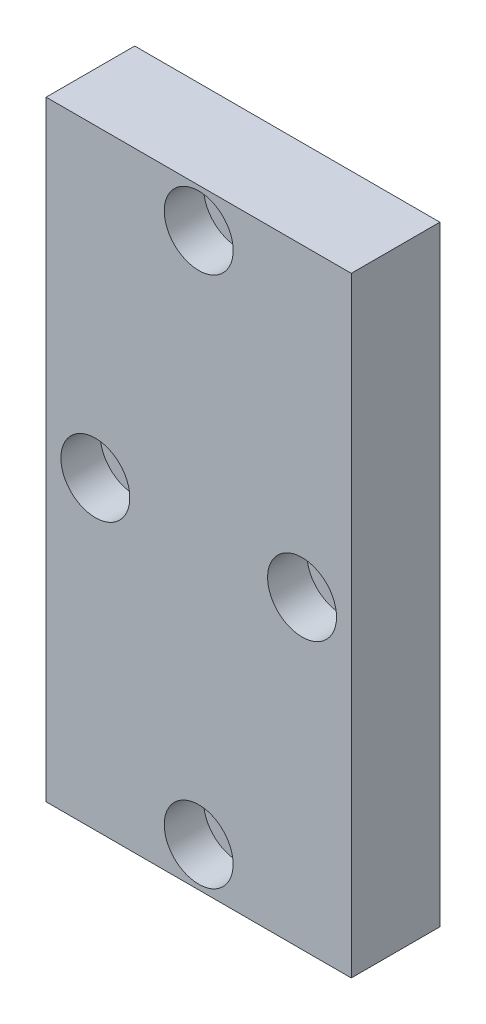
ISO-10303-21;
HEADER;
FILE_DESCRIPTION(('STEP AP214'),'2;1');
FILE_NAME('part.step','',(''),(''),'','','');
FILE_SCHEMA(('AUTOMOTIVE_DESIGN { 1 0 10303 214 1 1 1 1 }'));
ENDSEC;
DATA;
#1=APPLICATION_CONTEXT('core data for automotive mechanical design processes');
#2=APPLICATION_PROTOCOL_DEFINITION('international standard','automotive_design',2000,#1);
#3=PRODUCT_CONTEXT('',#1,'mechanical');
#4=PRODUCT('Part','Part','',(#3));
#5=PRODUCT_RELATED_PRODUCT_CATEGORY('part','',(#4));
#6=PRODUCT_DEFINITION_FORMATION('','',#4);
#7=PRODUCT_DEFINITION_CONTEXT('part definition',#1,'design');
#8=PRODUCT_DEFINITION('design','',#6,#7);
#9=PRODUCT_DEFINITION_SHAPE('','',#8);
#10=(LENGTH_UNIT() NAMED_UNIT(*) SI_UNIT(.MILLI.,.METRE.));
#11=(NAMED_UNIT(*) PLANE_ANGLE_UNIT() SI_UNIT($,.RADIAN.));
#12=(NAMED_UNIT(*) SI_UNIT($,.STERADIAN.) SOLID_ANGLE_UNIT());
#13=UNCERTAINTY_MEASURE_WITH_UNIT(LENGTH_MEASURE(1.E-05),#10,'distance_accuracy_value','');
#14=(GEOMETRIC_REPRESENTATION_CONTEXT(3) GLOBAL_UNCERTAINTY_ASSIGNED_CONTEXT((#13)) GLOBAL_UNIT_ASSIGNED_CONTEXT((#10,
#11,#12)) REPRESENTATION_CONTEXT('',''));
#15=CARTESIAN_POINT('',(0.,0.,0.));
#16=DIRECTION('',(0.,0.,1.));
#17=DIRECTION('',(1.,0.,0.));
#18=AXIS2_PLACEMENT_3D('',#15,#16,#17);
#19=CARTESIAN_POINT('',(10.5,0.,-1.));
#20=DIRECTION('',(0.,0.,1.));
#21=DIRECTION('',(1.,0.,0.));
#22=AXIS2_PLACEMENT_3D('',#19,#20,#21);
#23=CYLINDRICAL_SURFACE('',#22,2.);
#24=CARTESIAN_POINT('',(10.5,0.,0.));
#25=DIRECTION('',(0.,0.,1.));
#26=DIRECTION('',(1.,0.,0.));
#27=AXIS2_PLACEMENT_3D('',#24,#25,#26);
#28=CIRCLE('',#27,2.);
#29=CARTESIAN_POINT('',(12.5,0.,0.));
#30=VERTEX_POINT('',#29);
#31=EDGE_CURVE('E125',#30,#30,#28,.T.);
#32=ORIENTED_EDGE('',*,*,#31,.F.);
#33=EDGE_LOOP('',(#32));
#34=FACE_BOUND('',#33,.T.);
#35=CARTESIAN_POINT('',(10.5,0.,5.));
#36=DIRECTION('',(0.,0.,1.));
#37=DIRECTION('',(1.,0.,0.));
#38=AXIS2_PLACEMENT_3D('',#35,#36,#37);
#39=CIRCLE('',#38,2.);
#40=CARTESIAN_POINT('',(12.5,0.,5.));
#41=VERTEX_POINT('',#40);
#42=EDGE_CURVE('E42',#41,#41,#39,.F.);
#43=ORIENTED_EDGE('',*,*,#42,.F.);
#44=EDGE_LOOP('',(#43));
#45=FACE_BOUND('',#44,.T.);
#46=ADVANCED_FACE('F38',(#34,#45),#23,.F.);
#47=CARTESIAN_POINT('',(0.,27.,-1.));
#48=DIRECTION('',(0.,0.,1.));
#49=DIRECTION('',(1.,0.,0.));
#50=AXIS2_PLACEMENT_3D('',#47,#48,#49);
#51=CYLINDRICAL_SURFACE('',#50,2.);
#52=CARTESIAN_POINT('',(0.,27.,0.));
#53=DIRECTION('',(0.,0.,1.));
#54=DIRECTION('',(1.,0.,0.));
#55=AXIS2_PLACEMENT_3D('',#52,#53,#54);
#56=CIRCLE('',#55,2.);
#57=CARTESIAN_POINT('',(2.,27.,0.));
#58=VERTEX_POINT('',#57);
#59=EDGE_CURVE('E114',#58,#58,#56,.T.);
#60=ORIENTED_EDGE('',*,*,#59,.F.);
#61=EDGE_LOOP('',(#60));
#62=FACE_BOUND('',#61,.T.);
#63=CARTESIAN_POINT('',(0.,27.,5.));
#64=DIRECTION('',(0.,0.,1.));
#65=DIRECTION('',(1.,0.,0.));
#66=AXIS2_PLACEMENT_3D('',#63,#64,#65);
#67=CIRCLE('',#66,2.);
#68=CARTESIAN_POINT('',(2.,27.,5.));
#69=VERTEX_POINT('',#68);
#70=EDGE_CURVE('E140',#69,#69,#67,.F.);
#71=ORIENTED_EDGE('',*,*,#70,.F.);
#72=EDGE_LOOP('',(#71));
#73=FACE_BOUND('',#72,.T.);
#74=ADVANCED_FACE('F160',(#62,#73),#51,.F.);
#75=CARTESIAN_POINT('',(0.,0.,9.));
#76=DIRECTION('',(0.,0.,1.));
#77=DIRECTION('',(1.,0.,0.));
#78=AXIS2_PLACEMENT_3D('',#75,#76,#77);
#79=PLANE('',#78);
#80=CARTESIAN_POINT('',(0.,27.,9.));
#81=DIRECTION('',(0.,0.,1.));
#82=DIRECTION('',(1.,0.,0.));
#83=AXIS2_PLACEMENT_3D('',#80,#81,#82);
#84=CIRCLE('',#83,3.5);
#85=CARTESIAN_POINT('',(3.5,27.,9.));
#86=VERTEX_POINT('',#85);
#87=EDGE_CURVE('E245',#86,#86,#84,.T.);
#88=ORIENTED_EDGE('',*,*,#87,.F.);
#89=EDGE_LOOP('',(#88));
#90=FACE_BOUND('',#89,.T.);
#91=CARTESIAN_POINT('',(10.5,0.,9.));
#92=DIRECTION('',(0.,0.,1.));
#93=DIRECTION('',(1.,0.,0.));
#94=AXIS2_PLACEMENT_3D('',#91,#92,#93);
#95=CIRCLE('',#94,3.5);
#96=CARTESIAN_POINT('',(14.,0.,9.));
#97=VERTEX_POINT('',#96);
#98=EDGE_CURVE('E253',#97,#97,#95,.T.);
#99=ORIENTED_EDGE('',*,*,#98,.F.);
#100=EDGE_LOOP('',(#99));
#101=FACE_BOUND('',#100,.T.);
#102=CARTESIAN_POINT('',(-10.5,0.,9.));
#103=DIRECTION('',(0.,0.,1.));
#104=DIRECTION('',(-1.,0.,0.));
#105=AXIS2_PLACEMENT_3D('',#102,#103,#104);
#106=CIRCLE('',#105,3.5);
#107=CARTESIAN_POINT('',(-14.,0.,9.));
#108=VERTEX_POINT('',#107);
#109=EDGE_CURVE('E263',#108,#108,#106,.T.);
#110=ORIENTED_EDGE('',*,*,#109,.F.);
#111=EDGE_LOOP('',(#110));
#112=FACE_BOUND('',#111,.T.);
#113=CARTESIAN_POINT('',(0.,-27.,9.));
#114=DIRECTION('',(0.,0.,1.));
#115=DIRECTION('',(-1.,0.,0.));
#116=AXIS2_PLACEMENT_3D('',#113,#114,#115);
#117=CIRCLE('',#116,3.5);
#118=CARTESIAN_POINT('',(-3.5,-27.,9.));
#119=VERTEX_POINT('',#118);
#120=EDGE_CURVE('E271',#119,#119,#117,.T.);
#121=ORIENTED_EDGE('',*,*,#120,.F.);
#122=EDGE_LOOP('',(#121));
#123=FACE_BOUND('',#122,.T.);
#124=DIRECTION('',(0.,-1.,0.));
#125=VECTOR('',#124,1.);
#126=CARTESIAN_POINT('',(-15.5,31.,9.));
#127=LINE('',#126,#125);
#128=CARTESIAN_POINT('',(-15.5,31.,9.));
#129=VERTEX_POINT('',#128);
#130=CARTESIAN_POINT('',(-15.5,-31.,9.));
#131=VERTEX_POINT('',#130);
#132=EDGE_CURVE('E93',#129,#131,#127,.T.);
#133=ORIENTED_EDGE('',*,*,#132,.T.);
#134=DIRECTION('',(1.,0.,0.));
#135=VECTOR('',#134,1.);
#136=CARTESIAN_POINT('',(-15.5,-31.,9.));
#137=LINE('',#136,#135);
#138=CARTESIAN_POINT('',(15.5,-31.,9.));
#139=VERTEX_POINT('',#138);
#140=EDGE_CURVE('E88',#131,#139,#137,.T.);
#141=ORIENTED_EDGE('',*,*,#140,.T.);
#142=DIRECTION('',(0.,1.,0.));
#143=VECTOR('',#142,1.);
#144=CARTESIAN_POINT('',(15.5,31.,9.));
#145=LINE('',#144,#143);
#146=CARTESIAN_POINT('',(15.5,31.,9.));
#147=VERTEX_POINT('',#146);
#148=EDGE_CURVE('E91',#139,#147,#145,.T.);
#149=ORIENTED_EDGE('',*,*,#148,.T.);
#150=DIRECTION('',(-1.,0.,0.));
#151=VECTOR('',#150,1.);
#152=CARTESIAN_POINT('',(-15.5,31.,9.));
#153=LINE('',#152,#151);
#154=EDGE_CURVE('E58',#147,#129,#153,.T.);
#155=ORIENTED_EDGE('',*,*,#154,.T.);
#156=EDGE_LOOP('',(#133,#141,#149,#155));
#157=FACE_BOUND('',#156,.T.);
#158=ADVANCED_FACE('F89',(#90,#101,#112,#123,#157),#79,.T.);
#159=CARTESIAN_POINT('',(0.,0.,0.));
#160=DIRECTION('',(0.,0.,1.));
#161=DIRECTION('',(1.,0.,0.));
#162=AXIS2_PLACEMENT_3D('',#159,#160,#161);
#163=PLANE('',#162);
#164=ORIENTED_EDGE('',*,*,#59,.T.);
#165=EDGE_LOOP('',(#164));
#166=FACE_BOUND('',#165,.T.);
#167=ORIENTED_EDGE('',*,*,#31,.T.);
#168=EDGE_LOOP('',(#167));
#169=FACE_BOUND('',#168,.T.);
#170=DIRECTION('',(0.,-1.,0.));
#171=VECTOR('',#170,1.);
#172=CARTESIAN_POINT('',(-15.5,31.,0.));
#173=LINE('',#172,#171);
#174=CARTESIAN_POINT('',(-15.5,31.,0.));
#175=VERTEX_POINT('',#174);
#176=CARTESIAN_POINT('',(-15.5,-31.,0.));
#177=VERTEX_POINT('',#176);
#178=EDGE_CURVE('E110',#175,#177,#173,.T.);
#179=ORIENTED_EDGE('',*,*,#178,.F.);
#180=DIRECTION('',(-1.,0.,0.));
#181=VECTOR('',#180,1.);
#182=CARTESIAN_POINT('',(-15.5,31.,0.));
#183=LINE('',#182,#181);
#184=CARTESIAN_POINT('',(15.5,31.,0.));
#185=VERTEX_POINT('',#184);
#186=EDGE_CURVE('E81',#185,#175,#183,.T.);
#187=ORIENTED_EDGE('',*,*,#186,.F.);
#188=DIRECTION('',(0.,1.,0.));
#189=VECTOR('',#188,1.);
#190=CARTESIAN_POINT('',(15.5,31.,0.));
#191=LINE('',#190,#189);
#192=CARTESIAN_POINT('',(15.5,-31.,0.));
#193=VERTEX_POINT('',#192);
#194=EDGE_CURVE('E75',#193,#185,#191,.T.);
#195=ORIENTED_EDGE('',*,*,#194,.F.);
#196=DIRECTION('',(1.,0.,0.));
#197=VECTOR('',#196,1.);
#198=CARTESIAN_POINT('',(-15.5,-31.,0.));
#199=LINE('',#198,#197);
#200=EDGE_CURVE('E98',#177,#193,#199,.T.);
#201=ORIENTED_EDGE('',*,*,#200,.F.);
#202=EDGE_LOOP('',(#179,#187,#195,#201));
#203=FACE_BOUND('',#202,.T.);
#204=CARTESIAN_POINT('',(-10.5,0.,0.));
#205=DIRECTION('',(0.,0.,1.));
#206=DIRECTION('',(1.,0.,0.));
#207=AXIS2_PLACEMENT_3D('',#204,#205,#206);
#208=CIRCLE('',#207,2.);
#209=CARTESIAN_POINT('',(-8.49999999999999,0.,0.));
#210=VERTEX_POINT('',#209);
#211=EDGE_CURVE('E129',#210,#210,#208,.F.);
#212=ORIENTED_EDGE('',*,*,#211,.F.);
#213=EDGE_LOOP('',(#212));
#214=FACE_BOUND('',#213,.T.);
#215=CARTESIAN_POINT('',(0.,-27.,0.));
#216=DIRECTION('',(0.,0.,1.));
#217=DIRECTION('',(1.,0.,0.));
#218=AXIS2_PLACEMENT_3D('',#215,#216,#217);
#219=CIRCLE('',#218,2.);
#220=CARTESIAN_POINT('',(2.00000000000001,-27.,0.));
#221=VERTEX_POINT('',#220);
#222=EDGE_CURVE('E133',#221,#221,#219,.F.);
#223=ORIENTED_EDGE('',*,*,#222,.F.);
#224=EDGE_LOOP('',(#223));
#225=FACE_BOUND('',#224,.T.);
#226=ADVANCED_FACE('F176',(#166,#169,#203,#214,#225),#163,.F.);
#227=CARTESIAN_POINT('',(-15.5,31.,9.));
#228=DIRECTION('',(1.,0.,0.));
#229=DIRECTION('',(0.,1.,0.));
#230=AXIS2_PLACEMENT_3D('',#227,#228,#229);
#231=PLANE('',#230);
#232=ORIENTED_EDGE('',*,*,#178,.T.);
#233=DIRECTION('',(0.,0.,-1.));
#234=VECTOR('',#233,1.);
#235=CARTESIAN_POINT('',(-15.5,-31.,9.));
#236=LINE('',#235,#234);
#237=EDGE_CURVE('E11',#131,#177,#236,.T.);
#238=ORIENTED_EDGE('',*,*,#237,.F.);
#239=ORIENTED_EDGE('',*,*,#132,.F.);
#240=DIRECTION('',(0.,0.,-1.));
#241=VECTOR('',#240,1.);
#242=CARTESIAN_POINT('',(-15.5,31.,9.));
#243=LINE('',#242,#241);
#244=EDGE_CURVE('E106',#129,#175,#243,.T.);
#245=ORIENTED_EDGE('',*,*,#244,.T.);
#246=EDGE_LOOP('',(#232,#238,#239,#245));
#247=FACE_BOUND('',#246,.T.);
#248=ADVANCED_FACE('F40',(#247),#231,.F.);
#249=CARTESIAN_POINT('',(-15.5,-31.,9.));
#250=DIRECTION('',(0.,1.,0.));
#251=DIRECTION('',(0.,0.,1.));
#252=AXIS2_PLACEMENT_3D('',#249,#250,#251);
#253=PLANE('',#252);
#254=ORIENTED_EDGE('',*,*,#200,.T.);
#255=DIRECTION('',(0.,0.,-1.));
#256=VECTOR('',#255,1.);
#257=CARTESIAN_POINT('',(15.5,-31.,9.));
#258=LINE('',#257,#256);
#259=EDGE_CURVE('E49',#139,#193,#258,.T.);
#260=ORIENTED_EDGE('',*,*,#259,.F.);
#261=ORIENTED_EDGE('',*,*,#140,.F.);
#262=ORIENTED_EDGE('',*,*,#237,.T.);
#263=EDGE_LOOP('',(#254,#260,#261,#262));
#264=FACE_BOUND('',#263,.T.);
#265=ADVANCED_FACE('F97',(#264),#253,.F.);
#266=CARTESIAN_POINT('',(15.5,31.,9.));
#267=DIRECTION('',(-1.,0.,0.));
#268=DIRECTION('',(0.,-1.,0.));
#269=AXIS2_PLACEMENT_3D('',#266,#267,#268);
#270=PLANE('',#269);
#271=ORIENTED_EDGE('',*,*,#194,.T.);
#272=DIRECTION('',(0.,0.,-1.));
#273=VECTOR('',#272,1.);
#274=CARTESIAN_POINT('',(15.5,31.,9.));
#275=LINE('',#274,#273);
#276=EDGE_CURVE('E100',#147,#185,#275,.T.);
#277=ORIENTED_EDGE('',*,*,#276,.F.);
#278=ORIENTED_EDGE('',*,*,#148,.F.);
#279=ORIENTED_EDGE('',*,*,#259,.T.);
#280=EDGE_LOOP('',(#271,#277,#278,#279));
#281=FACE_BOUND('',#280,.T.);
#282=ADVANCED_FACE('F102',(#281),#270,.F.);
#283=CARTESIAN_POINT('',(-15.5,31.,9.));
#284=DIRECTION('',(0.,-1.,0.));
#285=DIRECTION('',(0.,0.,-1.));
#286=AXIS2_PLACEMENT_3D('',#283,#284,#285);
#287=PLANE('',#286);
#288=ORIENTED_EDGE('',*,*,#186,.T.);
#289=ORIENTED_EDGE('',*,*,#244,.F.);
#290=ORIENTED_EDGE('',*,*,#154,.F.);
#291=ORIENTED_EDGE('',*,*,#276,.T.);
#292=EDGE_LOOP('',(#288,#289,#290,#291));
#293=FACE_BOUND('',#292,.T.);
#294=ADVANCED_FACE('F181',(#293),#287,.F.);
#295=CARTESIAN_POINT('',(-10.5,0.,-1.));
#296=DIRECTION('',(0.,0.,1.));
#297=DIRECTION('',(1.,0.,0.));
#298=AXIS2_PLACEMENT_3D('',#295,#296,#297);
#299=CYLINDRICAL_SURFACE('',#298,2.);
#300=CARTESIAN_POINT('',(-10.5,0.,5.));
#301=DIRECTION('',(0.,0.,-1.));
#302=DIRECTION('',(-1.,0.,0.));
#303=AXIS2_PLACEMENT_3D('',#300,#301,#302);
#304=CIRCLE('',#303,2.);
#305=CARTESIAN_POINT('',(-12.5,0.,5.));
#306=VERTEX_POINT('',#305);
#307=EDGE_CURVE('E148',#306,#306,#304,.T.);
#308=ORIENTED_EDGE('',*,*,#307,.F.);
#309=EDGE_LOOP('',(#308));
#310=FACE_BOUND('',#309,.T.);
#311=ORIENTED_EDGE('',*,*,#211,.T.);
#312=EDGE_LOOP('',(#311));
#313=FACE_BOUND('',#312,.T.);
#314=ADVANCED_FACE('F172',(#310,#313),#299,.F.);
#315=CARTESIAN_POINT('',(0.,-27.,-1.));
#316=DIRECTION('',(0.,0.,1.));
#317=DIRECTION('',(1.,0.,0.));
#318=AXIS2_PLACEMENT_3D('',#315,#316,#317);
#319=CYLINDRICAL_SURFACE('',#318,2.);
#320=CARTESIAN_POINT('',(0.,-27.,5.));
#321=DIRECTION('',(0.,0.,-1.));
#322=DIRECTION('',(-1.,0.,0.));
#323=AXIS2_PLACEMENT_3D('',#320,#321,#322);
#324=CIRCLE('',#323,2.);
#325=CARTESIAN_POINT('',(-2.,-27.,5.));
#326=VERTEX_POINT('',#325);
#327=EDGE_CURVE('E144',#326,#326,#324,.T.);
#328=ORIENTED_EDGE('',*,*,#327,.F.);
#329=EDGE_LOOP('',(#328));
#330=FACE_BOUND('',#329,.T.);
#331=ORIENTED_EDGE('',*,*,#222,.T.);
#332=EDGE_LOOP('',(#331));
#333=FACE_BOUND('',#332,.T.);
#334=ADVANCED_FACE('F199',(#330,#333),#319,.F.);
#335=CARTESIAN_POINT('',(0.,27.,5.));
#336=DIRECTION('',(0.,0.,1.));
#337=DIRECTION('',(1.,0.,0.));
#338=AXIS2_PLACEMENT_3D('',#335,#336,#337);
#339=PLANE('',#338);
#340=CARTESIAN_POINT('',(0.,27.,5.));
#341=DIRECTION('',(0.,0.,1.));
#342=DIRECTION('',(1.,0.,0.));
#343=AXIS2_PLACEMENT_3D('',#340,#341,#342);
#344=CIRCLE('',#343,3.5);
#345=CARTESIAN_POINT('',(3.5,27.,5.));
#346=VERTEX_POINT('',#345);
#347=EDGE_CURVE('E145',#346,#346,#344,.T.);
#348=ORIENTED_EDGE('',*,*,#347,.T.);
#349=EDGE_LOOP('',(#348));
#350=FACE_BOUND('',#349,.T.);
#351=ORIENTED_EDGE('',*,*,#70,.T.);
#352=EDGE_LOOP('',(#351));
#353=FACE_BOUND('',#352,.T.);
#354=ADVANCED_FACE('F201',(#350,#353),#339,.T.);
#355=CARTESIAN_POINT('',(0.,27.,5.));
#356=DIRECTION('',(0.,0.,1.));
#357=DIRECTION('',(1.,0.,0.));
#358=AXIS2_PLACEMENT_3D('',#355,#356,#357);
#359=CYLINDRICAL_SURFACE('',#358,3.5);
#360=ORIENTED_EDGE('',*,*,#347,.F.);
#361=EDGE_LOOP('',(#360));
#362=FACE_BOUND('',#361,.T.);
#363=ORIENTED_EDGE('',*,*,#87,.T.);
#364=EDGE_LOOP('',(#363));
#365=FACE_BOUND('',#364,.T.);
#366=ADVANCED_FACE('F208',(#362,#365),#359,.F.);
#367=CARTESIAN_POINT('',(0.,-27.,5.));
#368=DIRECTION('',(0.,0.,1.));
#369=DIRECTION('',(1.,0.,0.));
#370=AXIS2_PLACEMENT_3D('',#367,#368,#369);
#371=CYLINDRICAL_SURFACE('',#370,3.5);
#372=CARTESIAN_POINT('',(0.,-27.,5.));
#373=DIRECTION('',(0.,0.,1.));
#374=DIRECTION('',(-1.,0.,0.));
#375=AXIS2_PLACEMENT_3D('',#372,#373,#374);
#376=CIRCLE('',#375,3.5);
#377=CARTESIAN_POINT('',(-3.5,-27.,5.));
#378=VERTEX_POINT('',#377);
#379=EDGE_CURVE('E267',#378,#378,#376,.T.);
#380=ORIENTED_EDGE('',*,*,#379,.F.);
#381=EDGE_LOOP('',(#380));
#382=FACE_BOUND('',#381,.T.);
#383=ORIENTED_EDGE('',*,*,#120,.T.);
#384=EDGE_LOOP('',(#383));
#385=FACE_BOUND('',#384,.T.);
#386=ADVANCED_FACE('F214',(#382,#385),#371,.F.);
#387=CARTESIAN_POINT('',(0.,-27.,5.));
#388=DIRECTION('',(0.,0.,-1.));
#389=DIRECTION('',(-1.,0.,0.));
#390=AXIS2_PLACEMENT_3D('',#387,#388,#389);
#391=PLANE('',#390);
#392=ORIENTED_EDGE('',*,*,#327,.T.);
#393=EDGE_LOOP('',(#392));
#394=FACE_BOUND('',#393,.T.);
#395=ORIENTED_EDGE('',*,*,#379,.T.);
#396=EDGE_LOOP('',(#395));
#397=FACE_BOUND('',#396,.T.);
#398=ADVANCED_FACE('F217',(#394,#397),#391,.F.);
#399=CARTESIAN_POINT('',(-10.5,0.,5.));
#400=DIRECTION('',(0.,0.,1.));
#401=DIRECTION('',(1.,0.,0.));
#402=AXIS2_PLACEMENT_3D('',#399,#400,#401);
#403=CYLINDRICAL_SURFACE('',#402,3.5);
#404=CARTESIAN_POINT('',(-10.5,0.,5.));
#405=DIRECTION('',(0.,0.,1.));
#406=DIRECTION('',(-1.,0.,0.));
#407=AXIS2_PLACEMENT_3D('',#404,#405,#406);
#408=CIRCLE('',#407,3.5);
#409=CARTESIAN_POINT('',(-14.,0.,5.));
#410=VERTEX_POINT('',#409);
#411=EDGE_CURVE('E259',#410,#410,#408,.T.);
#412=ORIENTED_EDGE('',*,*,#411,.F.);
#413=EDGE_LOOP('',(#412));
#414=FACE_BOUND('',#413,.T.);
#415=ORIENTED_EDGE('',*,*,#109,.T.);
#416=EDGE_LOOP('',(#415));
#417=FACE_BOUND('',#416,.T.);
#418=ADVANCED_FACE('F221',(#414,#417),#403,.F.);
#419=CARTESIAN_POINT('',(-10.5,0.,5.));
#420=DIRECTION('',(0.,0.,-1.));
#421=DIRECTION('',(-1.,0.,0.));
#422=AXIS2_PLACEMENT_3D('',#419,#420,#421);
#423=PLANE('',#422);
#424=ORIENTED_EDGE('',*,*,#307,.T.);
#425=EDGE_LOOP('',(#424));
#426=FACE_BOUND('',#425,.T.);
#427=ORIENTED_EDGE('',*,*,#411,.T.);
#428=EDGE_LOOP('',(#427));
#429=FACE_BOUND('',#428,.T.);
#430=ADVANCED_FACE('F225',(#426,#429),#423,.F.);
#431=CARTESIAN_POINT('',(10.5,0.,5.));
#432=DIRECTION('',(0.,0.,1.));
#433=DIRECTION('',(1.,0.,0.));
#434=AXIS2_PLACEMENT_3D('',#431,#432,#433);
#435=PLANE('',#434);
#436=CARTESIAN_POINT('',(10.5,0.,5.));
#437=DIRECTION('',(0.,0.,1.));
#438=DIRECTION('',(1.,0.,0.));
#439=AXIS2_PLACEMENT_3D('',#436,#437,#438);
#440=CIRCLE('',#439,3.5);
#441=CARTESIAN_POINT('',(14.,0.,5.));
#442=VERTEX_POINT('',#441);
#443=EDGE_CURVE('E247',#442,#442,#440,.T.);
#444=ORIENTED_EDGE('',*,*,#443,.T.);
#445=EDGE_LOOP('',(#444));
#446=FACE_BOUND('',#445,.T.);
#447=ORIENTED_EDGE('',*,*,#42,.T.);
#448=EDGE_LOOP('',(#447));
#449=FACE_BOUND('',#448,.T.);
#450=ADVANCED_FACE('F157',(#446,#449),#435,.T.);
#451=CARTESIAN_POINT('',(10.5,0.,5.));
#452=DIRECTION('',(0.,0.,1.));
#453=DIRECTION('',(1.,0.,0.));
#454=AXIS2_PLACEMENT_3D('',#451,#452,#453);
#455=CYLINDRICAL_SURFACE('',#454,3.5);
#456=ORIENTED_EDGE('',*,*,#443,.F.);
#457=EDGE_LOOP('',(#456));
#458=FACE_BOUND('',#457,.T.);
#459=ORIENTED_EDGE('',*,*,#98,.T.);
#460=EDGE_LOOP('',(#459));
#461=FACE_BOUND('',#460,.T.);
#462=ADVANCED_FACE('F229',(#458,#461),#455,.F.);
#463=CLOSED_SHELL('',(#46,#74,#158,#226,#248,#265,#282,#294,#314,#334,#354,#366,#386,#398,#418,
#430,#450,#462));
#464=MANIFOLD_SOLID_BREP('B2',#463);
#465=ADVANCED_BREP_SHAPE_REPRESENTATION('',(#18,#464),#14);
#466=SHAPE_DEFINITION_REPRESENTATION(#9,#465);
ENDSEC;
END-ISO-10303-21;
